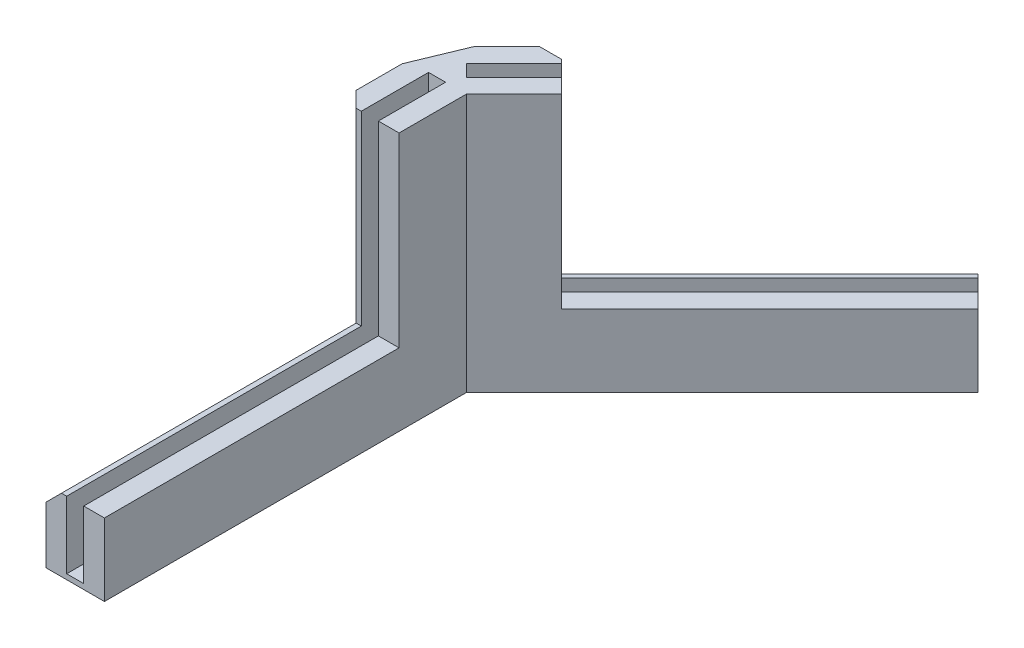
ISO-10303-21;
HEADER;
FILE_DESCRIPTION(('STEP AP214'),'2;1');
FILE_NAME('part.step','',(''),(''),'','','');
FILE_SCHEMA(('AUTOMOTIVE_DESIGN { 1 0 10303 214 1 1 1 1 }'));
ENDSEC;
DATA;
#1=APPLICATION_CONTEXT('core data for automotive mechanical design processes');
#2=APPLICATION_PROTOCOL_DEFINITION('international standard','automotive_design',2000,#1);
#3=PRODUCT_CONTEXT('',#1,'mechanical');
#4=PRODUCT('Part','Part','',(#3));
#5=PRODUCT_RELATED_PRODUCT_CATEGORY('part','',(#4));
#6=PRODUCT_DEFINITION_FORMATION('','',#4);
#7=PRODUCT_DEFINITION_CONTEXT('part definition',#1,'design');
#8=PRODUCT_DEFINITION('design','',#6,#7);
#9=PRODUCT_DEFINITION_SHAPE('','',#8);
#10=(LENGTH_UNIT() NAMED_UNIT(*) SI_UNIT(.MILLI.,.METRE.));
#11=(NAMED_UNIT(*) PLANE_ANGLE_UNIT() SI_UNIT($,.RADIAN.));
#12=(NAMED_UNIT(*) SI_UNIT($,.STERADIAN.) SOLID_ANGLE_UNIT());
#13=UNCERTAINTY_MEASURE_WITH_UNIT(LENGTH_MEASURE(1.E-05),#10,'distance_accuracy_value','');
#14=(GEOMETRIC_REPRESENTATION_CONTEXT(3) GLOBAL_UNCERTAINTY_ASSIGNED_CONTEXT((#13)) GLOBAL_UNIT_ASSIGNED_CONTEXT((#10,
#11,#12)) REPRESENTATION_CONTEXT('',''));
#15=CARTESIAN_POINT('',(0.,0.,0.));
#16=DIRECTION('',(0.,0.,1.));
#17=DIRECTION('',(1.,0.,0.));
#18=AXIS2_PLACEMENT_3D('',#15,#16,#17);
#19=CARTESIAN_POINT('',(-13.,50.,3.11837383565331));
#20=DIRECTION('',(0.923879869163213,0.,0.382682619614433));
#21=DIRECTION('',(0.,-1.,0.));
#22=AXIS2_PLACEMENT_3D('',#19,#20,#21);
#23=PLANE('',#22);
#24=DIRECTION('',(0.,-1.,0.));
#25=VECTOR('',#24,1.);
#26=CARTESIAN_POINT('',(-13.,50.,3.11837383565331));
#27=LINE('',#26,#25);
#28=CARTESIAN_POINT('',(-13.,50.,3.11837383565332));
#29=VERTEX_POINT('',#28);
#30=CARTESIAN_POINT('',(-13.,0.,3.11837383565332));
#31=VERTEX_POINT('',#30);
#32=EDGE_CURVE('E384',#29,#31,#27,.T.);
#33=ORIENTED_EDGE('',*,*,#32,.F.);
#34=DIRECTION('',(0.382682619614433,0.,-0.923879869163213));
#35=VECTOR('',#34,1.);
#36=CARTESIAN_POINT('',(-13.,50.,3.11837383565331));
#37=LINE('',#36,#35);
#38=CARTESIAN_POINT('',(-8.89951235406099,50.,-6.78110368347837));
#39=VERTEX_POINT('',#38);
#40=EDGE_CURVE('E389',#39,#29,#37,.F.);
#41=ORIENTED_EDGE('',*,*,#40,.F.);
#42=DIRECTION('',(0.,1.,0.));
#43=VECTOR('',#42,1.);
#44=CARTESIAN_POINT('',(-8.89951235406099,50.,-6.78110368347838));
#45=LINE('',#44,#43);
#46=CARTESIAN_POINT('',(-8.89951235406099,0.,-6.78110368347837));
#47=VERTEX_POINT('',#46);
#48=EDGE_CURVE('E387',#47,#39,#45,.T.);
#49=ORIENTED_EDGE('',*,*,#48,.F.);
#50=DIRECTION('',(-0.382682619614433,0.,0.923879869163213));
#51=VECTOR('',#50,1.);
#52=CARTESIAN_POINT('',(-9.99369246144622,0.,-4.13951265572129));
#53=LINE('',#52,#51);
#54=EDGE_CURVE('E227',#31,#47,#53,.F.);
#55=ORIENTED_EDGE('',*,*,#54,.F.);
#56=EDGE_LOOP('',(#33,#41,#49,#55));
#57=FACE_BOUND('',#56,.T.);
#58=ADVANCED_FACE('F40',(#57),#23,.F.);
#59=CARTESIAN_POINT('',(-1.7,50.,15.));
#60=DIRECTION('',(0.,0.,-1.));
#61=DIRECTION('',(-1.,0.,0.));
#62=AXIS2_PLACEMENT_3D('',#59,#60,#61);
#63=PLANE('',#62);
#64=DIRECTION('',(1.,0.,0.));
#65=VECTOR('',#64,1.);
#66=CARTESIAN_POINT('',(-9.,50.,15.));
#67=LINE('',#66,#65);
#68=CARTESIAN_POINT('',(-10.0000000000001,50.,15.));
#69=VERTEX_POINT('',#68);
#70=CARTESIAN_POINT('',(-9.,50.,15.));
#71=VERTEX_POINT('',#70);
#72=EDGE_CURVE('E354',#69,#71,#67,.T.);
#73=ORIENTED_EDGE('',*,*,#72,.F.);
#74=DIRECTION('',(0.,-1.,0.));
#75=VECTOR('',#74,1.);
#76=CARTESIAN_POINT('',(-10.0000000000001,50.,15.));
#77=LINE('',#76,#75);
#78=CARTESIAN_POINT('',(-10.0000000000001,14.,15.));
#79=VERTEX_POINT('',#78);
#80=EDGE_CURVE('E392',#69,#79,#77,.T.);
#81=ORIENTED_EDGE('',*,*,#80,.T.);
#82=DIRECTION('',(-1.,0.,0.));
#83=VECTOR('',#82,1.);
#84=CARTESIAN_POINT('',(-13.0000000000001,14.,15.));
#85=LINE('',#84,#83);
#86=CARTESIAN_POINT('',(-9.,14.,15.));
#87=VERTEX_POINT('',#86);
#88=EDGE_CURVE('E311',#87,#79,#85,.T.);
#89=ORIENTED_EDGE('',*,*,#88,.F.);
#90=DIRECTION('',(0.,-1.,0.));
#91=VECTOR('',#90,1.);
#92=CARTESIAN_POINT('',(-9.,50.,15.));
#93=LINE('',#92,#91);
#94=EDGE_CURVE('E381',#71,#87,#93,.T.);
#95=ORIENTED_EDGE('',*,*,#94,.F.);
#96=EDGE_LOOP('',(#73,#81,#89,#95));
#97=FACE_BOUND('',#96,.T.);
#98=ADVANCED_FACE('F509',(#97),#63,.F.);
#99=DIRECTION('',(-1.,0.,0.));
#100=VECTOR('',#99,1.);
#101=CARTESIAN_POINT('',(-5.70000000000014,14.,15.));
#102=LINE('',#101,#100);
#103=CARTESIAN_POINT('',(-1.7,14.,15.));
#104=VERTEX_POINT('',#103);
#105=CARTESIAN_POINT('',(-5.70000000000014,14.,15.));
#106=VERTEX_POINT('',#105);
#107=EDGE_CURVE('E307',#104,#106,#102,.T.);
#108=ORIENTED_EDGE('',*,*,#107,.F.);
#109=DIRECTION('',(0.,-1.,0.));
#110=VECTOR('',#109,1.);
#111=CARTESIAN_POINT('',(-1.7,50.,15.));
#112=LINE('',#111,#110);
#113=CARTESIAN_POINT('',(-1.7,50.,15.));
#114=VERTEX_POINT('',#113);
#115=EDGE_CURVE('E367',#114,#104,#112,.T.);
#116=ORIENTED_EDGE('',*,*,#115,.F.);
#117=DIRECTION('',(1.,0.,0.));
#118=VECTOR('',#117,1.);
#119=CARTESIAN_POINT('',(-1.7,50.,15.));
#120=LINE('',#119,#118);
#121=CARTESIAN_POINT('',(-5.7,50.,15.));
#122=VERTEX_POINT('',#121);
#123=EDGE_CURVE('E363',#122,#114,#120,.T.);
#124=ORIENTED_EDGE('',*,*,#123,.F.);
#125=DIRECTION('',(0.,-1.,0.));
#126=VECTOR('',#125,1.);
#127=CARTESIAN_POINT('',(-5.7,50.,15.));
#128=LINE('',#127,#126);
#129=EDGE_CURVE('E373',#122,#106,#128,.T.);
#130=ORIENTED_EDGE('',*,*,#129,.T.);
#131=EDGE_LOOP('',(#108,#116,#124,#130));
#132=FACE_BOUND('',#131,.T.);
#133=ADVANCED_FACE('F511',(#132),#63,.F.);
#134=CARTESIAN_POINT('',(-9.00000000000004,50.,1.99999999999999));
#135=DIRECTION('',(-1.,0.,0.));
#136=DIRECTION('',(0.,0.,1.));
#137=AXIS2_PLACEMENT_3D('',#134,#135,#136);
#138=PLANE('',#137);
#139=DIRECTION('',(0.,0.,-1.));
#140=VECTOR('',#139,1.);
#141=CARTESIAN_POINT('',(-9.00000000000004,1.,15.));
#142=LINE('',#141,#140);
#143=CARTESIAN_POINT('',(-9.,1.,72.));
#144=VERTEX_POINT('',#143);
#145=CARTESIAN_POINT('',(-9.00000000000004,1.,1.99999999999999));
#146=VERTEX_POINT('',#145);
#147=EDGE_CURVE('E345',#144,#146,#142,.T.);
#148=ORIENTED_EDGE('',*,*,#147,.T.);
#149=DIRECTION('',(0.,-1.,0.));
#150=VECTOR('',#149,1.);
#151=CARTESIAN_POINT('',(-9.00000000000004,50.,1.99999999999999));
#152=LINE('',#151,#150);
#153=CARTESIAN_POINT('',(-9.00000000000004,50.,1.99999999999999));
#154=VERTEX_POINT('',#153);
#155=EDGE_CURVE('E378',#154,#146,#152,.T.);
#156=ORIENTED_EDGE('',*,*,#155,.F.);
#157=DIRECTION('',(0.,0.,-1.));
#158=VECTOR('',#157,1.);
#159=CARTESIAN_POINT('',(-9.00000000000004,50.,1.99999999999999));
#160=LINE('',#159,#158);
#161=EDGE_CURVE('E357',#71,#154,#160,.T.);
#162=ORIENTED_EDGE('',*,*,#161,.F.);
#163=ORIENTED_EDGE('',*,*,#94,.T.);
#164=DIRECTION('',(0.,0.,-1.));
#165=VECTOR('',#164,1.);
#166=CARTESIAN_POINT('',(-9.00000000000013,14.,72.));
#167=LINE('',#166,#165);
#168=CARTESIAN_POINT('',(-9.00000000000013,14.,72.));
#169=VERTEX_POINT('',#168);
#170=EDGE_CURVE('E329',#169,#87,#167,.T.);
#171=ORIENTED_EDGE('',*,*,#170,.F.);
#172=DIRECTION('',(0.,1.,0.));
#173=VECTOR('',#172,1.);
#174=CARTESIAN_POINT('',(-9.,1.,72.));
#175=LINE('',#174,#173);
#176=EDGE_CURVE('E324',#144,#169,#175,.T.);
#177=ORIENTED_EDGE('',*,*,#176,.F.);
#178=EDGE_LOOP('',(#148,#156,#162,#163,#171,#177));
#179=FACE_BOUND('',#178,.T.);
#180=ADVANCED_FACE('F485',(#179),#138,.F.);
#181=CARTESIAN_POINT('',(-5.7,50.,1.99999999999999));
#182=DIRECTION('',(0.,0.,-1.));
#183=DIRECTION('',(-1.,0.,0.));
#184=AXIS2_PLACEMENT_3D('',#181,#182,#183);
#185=PLANE('',#184);
#186=DIRECTION('',(-1.,0.,0.));
#187=VECTOR('',#186,1.);
#188=CARTESIAN_POINT('',(-5.7,1.,1.99999999999998));
#189=LINE('',#188,#187);
#190=CARTESIAN_POINT('',(-5.7,1.,1.99999999999999));
#191=VERTEX_POINT('',#190);
#192=EDGE_CURVE('E342',#191,#146,#189,.T.);
#193=ORIENTED_EDGE('',*,*,#192,.F.);
#194=DIRECTION('',(0.,-1.,0.));
#195=VECTOR('',#194,1.);
#196=CARTESIAN_POINT('',(-5.7,50.,1.99999999999999));
#197=LINE('',#196,#195);
#198=CARTESIAN_POINT('',(-5.7,50.,1.99999999999999));
#199=VERTEX_POINT('',#198);
#200=EDGE_CURVE('E375',#199,#191,#197,.T.);
#201=ORIENTED_EDGE('',*,*,#200,.F.);
#202=DIRECTION('',(1.,0.,0.));
#203=VECTOR('',#202,1.);
#204=CARTESIAN_POINT('',(-5.7,50.,1.99999999999999));
#205=LINE('',#204,#203);
#206=EDGE_CURVE('E359',#154,#199,#205,.T.);
#207=ORIENTED_EDGE('',*,*,#206,.F.);
#208=ORIENTED_EDGE('',*,*,#155,.T.);
#209=EDGE_LOOP('',(#193,#201,#207,#208));
#210=FACE_BOUND('',#209,.T.);
#211=ADVANCED_FACE('F490',(#210),#185,.F.);
#212=CARTESIAN_POINT('',(-5.7,50.,15.));
#213=DIRECTION('',(1.,0.,0.));
#214=DIRECTION('',(0.,0.,-1.));
#215=AXIS2_PLACEMENT_3D('',#212,#213,#214);
#216=PLANE('',#215);
#217=DIRECTION('',(0.,0.,-1.));
#218=VECTOR('',#217,1.);
#219=CARTESIAN_POINT('',(-5.7,1.,15.));
#220=LINE('',#219,#218);
#221=CARTESIAN_POINT('',(-5.7,1.,72.));
#222=VERTEX_POINT('',#221);
#223=EDGE_CURVE('E347',#222,#191,#220,.T.);
#224=ORIENTED_EDGE('',*,*,#223,.F.);
#225=DIRECTION('',(0.,-1.,0.));
#226=VECTOR('',#225,1.);
#227=CARTESIAN_POINT('',(-5.7,1.,72.));
#228=LINE('',#227,#226);
#229=CARTESIAN_POINT('',(-5.70000000000014,14.,72.));
#230=VERTEX_POINT('',#229);
#231=EDGE_CURVE('E318',#230,#222,#228,.T.);
#232=ORIENTED_EDGE('',*,*,#231,.F.);
#233=DIRECTION('',(0.,0.,-1.));
#234=VECTOR('',#233,1.);
#235=CARTESIAN_POINT('',(-5.70000000000014,14.,72.));
#236=LINE('',#235,#234);
#237=EDGE_CURVE('E336',#230,#106,#236,.T.);
#238=ORIENTED_EDGE('',*,*,#237,.T.);
#239=ORIENTED_EDGE('',*,*,#129,.F.);
#240=DIRECTION('',(0.,0.,1.));
#241=VECTOR('',#240,1.);
#242=CARTESIAN_POINT('',(-5.7,50.,15.));
#243=LINE('',#242,#241);
#244=EDGE_CURVE('E361',#199,#122,#243,.T.);
#245=ORIENTED_EDGE('',*,*,#244,.F.);
#246=ORIENTED_EDGE('',*,*,#200,.T.);
#247=EDGE_LOOP('',(#224,#232,#238,#239,#245,#246));
#248=FACE_BOUND('',#247,.T.);
#249=ADVANCED_FACE('F523',(#248),#216,.F.);
#250=CARTESIAN_POINT('',(-13.,50.,15.));
#251=DIRECTION('',(1.,0.,0.));
#252=DIRECTION('',(0.,0.,-1.));
#253=AXIS2_PLACEMENT_3D('',#250,#251,#252);
#254=PLANE('',#253);
#255=DIRECTION('',(0.,0.,-1.));
#256=VECTOR('',#255,1.);
#257=CARTESIAN_POINT('',(-13.,11.0000000000001,15.));
#258=LINE('',#257,#256);
#259=CARTESIAN_POINT('',(-13.0000000000001,11.0000000000001,72.));
#260=VERTEX_POINT('',#259);
#261=CARTESIAN_POINT('',(-13.,11.0000000000001,12.0000000000001));
#262=VERTEX_POINT('',#261);
#263=EDGE_CURVE('E395',#260,#262,#258,.T.);
#264=ORIENTED_EDGE('',*,*,#263,.T.);
#265=DIRECTION('',(0.,1.,0.));
#266=VECTOR('',#265,1.);
#267=CARTESIAN_POINT('',(-13.,50.,12.0000000000001));
#268=LINE('',#267,#266);
#269=CARTESIAN_POINT('',(-13.,50.,12.0000000000001));
#270=VERTEX_POINT('',#269);
#271=EDGE_CURVE('E397',#262,#270,#268,.T.);
#272=ORIENTED_EDGE('',*,*,#271,.T.);
#273=DIRECTION('',(0.,0.,1.));
#274=VECTOR('',#273,1.);
#275=CARTESIAN_POINT('',(-13.,50.,15.));
#276=LINE('',#275,#274);
#277=EDGE_CURVE('E351',#29,#270,#276,.T.);
#278=ORIENTED_EDGE('',*,*,#277,.F.);
#279=ORIENTED_EDGE('',*,*,#32,.T.);
#280=DIRECTION('',(0.,0.,1.));
#281=VECTOR('',#280,1.);
#282=CARTESIAN_POINT('',(-13.,0.,15.));
#283=LINE('',#282,#281);
#284=CARTESIAN_POINT('',(-13.,0.,72.));
#285=VERTEX_POINT('',#284);
#286=EDGE_CURVE('E350',#31,#285,#283,.T.);
#287=ORIENTED_EDGE('',*,*,#286,.T.);
#288=DIRECTION('',(0.,-1.,0.));
#289=VECTOR('',#288,1.);
#290=CARTESIAN_POINT('',(-13.,0.,72.));
#291=LINE('',#290,#289);
#292=EDGE_CURVE('E308',#260,#285,#291,.T.);
#293=ORIENTED_EDGE('',*,*,#292,.F.);
#294=EDGE_LOOP('',(#264,#272,#278,#279,#287,#293));
#295=FACE_BOUND('',#294,.T.);
#296=ADVANCED_FACE('F505',(#295),#254,.F.);
#297=CARTESIAN_POINT('',(-1.7,50.,1.99999999999999));
#298=DIRECTION('',(-1.,0.,0.));
#299=DIRECTION('',(0.,0.,1.));
#300=AXIS2_PLACEMENT_3D('',#297,#298,#299);
#301=PLANE('',#300);
#302=DIRECTION('',(0.,0.,-1.));
#303=VECTOR('',#302,1.);
#304=CARTESIAN_POINT('',(-1.7,0.,1.99999999999999));
#305=LINE('',#304,#303);
#306=CARTESIAN_POINT('',(-1.7,0.,72.));
#307=VERTEX_POINT('',#306);
#308=CARTESIAN_POINT('',(-1.7,0.,1.99999999999999));
#309=VERTEX_POINT('',#308);
#310=EDGE_CURVE('E355',#307,#309,#305,.T.);
#311=ORIENTED_EDGE('',*,*,#310,.T.);
#312=DIRECTION('',(0.,-1.,0.));
#313=VECTOR('',#312,1.);
#314=CARTESIAN_POINT('',(-1.7,50.,1.99999999999999));
#315=LINE('',#314,#313);
#316=CARTESIAN_POINT('',(-1.7,50.,1.99999999999999));
#317=VERTEX_POINT('',#316);
#318=EDGE_CURVE('E287',#317,#309,#315,.T.);
#319=ORIENTED_EDGE('',*,*,#318,.F.);
#320=DIRECTION('',(0.,0.,-1.));
#321=VECTOR('',#320,1.);
#322=CARTESIAN_POINT('',(-1.7,50.,1.99999999999999));
#323=LINE('',#322,#321);
#324=EDGE_CURVE('E365',#114,#317,#323,.T.);
#325=ORIENTED_EDGE('',*,*,#324,.F.);
#326=ORIENTED_EDGE('',*,*,#115,.T.);
#327=DIRECTION('',(0.,0.,-1.));
#328=VECTOR('',#327,1.);
#329=CARTESIAN_POINT('',(-1.70000000000015,14.,72.));
#330=LINE('',#329,#328);
#331=CARTESIAN_POINT('',(-1.70000000000015,14.,72.));
#332=VERTEX_POINT('',#331);
#333=EDGE_CURVE('E339',#332,#104,#330,.T.);
#334=ORIENTED_EDGE('',*,*,#333,.F.);
#335=DIRECTION('',(0.,1.,0.));
#336=VECTOR('',#335,1.);
#337=CARTESIAN_POINT('',(-1.7,0.,72.));
#338=LINE('',#337,#336);
#339=EDGE_CURVE('E314',#307,#332,#338,.T.);
#340=ORIENTED_EDGE('',*,*,#339,.F.);
#341=EDGE_LOOP('',(#311,#319,#325,#326,#334,#340));
#342=FACE_BOUND('',#341,.T.);
#343=ADVANCED_FACE('F470',(#342),#301,.F.);
#344=CARTESIAN_POINT('',(0.,50.,0.));
#345=DIRECTION('',(0.,-1.,0.));
#346=DIRECTION('',(0.,0.,-1.));
#347=AXIS2_PLACEMENT_3D('',#344,#345,#346);
#348=PLANE('',#347);
#349=ORIENTED_EDGE('',*,*,#277,.T.);
#350=DIRECTION('',(-0.707106781186549,0.,-0.707106781186546));
#351=VECTOR('',#350,1.);
#352=CARTESIAN_POINT('',(-10.0000000000001,50.,15.));
#353=LINE('',#352,#351);
#354=EDGE_CURVE('E401',#270,#69,#353,.F.);
#355=ORIENTED_EDGE('',*,*,#354,.T.);
#356=ORIENTED_EDGE('',*,*,#72,.T.);
#357=ORIENTED_EDGE('',*,*,#161,.T.);
#358=ORIENTED_EDGE('',*,*,#206,.T.);
#359=ORIENTED_EDGE('',*,*,#244,.T.);
#360=ORIENTED_EDGE('',*,*,#123,.T.);
#361=ORIENTED_EDGE('',*,*,#324,.T.);
#362=DIRECTION('',(-0.707105537080835,0.,0.707108025290071));
#363=VECTOR('',#362,1.);
#364=CARTESIAN_POINT('',(-1.7,50.,1.99999999999999));
#365=LINE('',#364,#363);
#366=CARTESIAN_POINT('',(7.49237198205085,50.,-7.19240432877094));
#367=VERTEX_POINT('',#366);
#368=EDGE_CURVE('E285',#367,#317,#365,.T.);
#369=ORIENTED_EDGE('',*,*,#368,.F.);
#370=DIRECTION('',(0.707108025290071,0.,0.707105537080835));
#371=VECTOR('',#370,1.);
#372=CARTESIAN_POINT('',(7.49237198205085,50.,-7.19240432877094));
#373=LINE('',#372,#371);
#374=CARTESIAN_POINT('',(4.66393988089057,50.,-10.0208264770943));
#375=VERTEX_POINT('',#374);
#376=EDGE_CURVE('E282',#375,#367,#373,.T.);
#377=ORIENTED_EDGE('',*,*,#376,.F.);
#378=DIRECTION('',(0.707105537080835,0.,-0.707108025290071));
#379=VECTOR('',#378,1.);
#380=CARTESIAN_POINT('',(4.66393988089057,50.,-10.0208264770943));
#381=LINE('',#380,#379);
#382=CARTESIAN_POINT('',(-4.52843210116029,50.,-0.828422148323351));
#383=VERTEX_POINT('',#382);
#384=EDGE_CURVE('E280',#383,#375,#381,.T.);
#385=ORIENTED_EDGE('',*,*,#384,.F.);
#386=DIRECTION('',(0.707108025290071,0.,0.707105537080835));
#387=VECTOR('',#386,1.);
#388=CARTESIAN_POINT('',(-4.52843210116029,50.,-0.828422148323351));
#389=LINE('',#388,#387);
#390=CARTESIAN_POINT('',(-6.86188858461755,50.,-3.16187042069014));
#391=VERTEX_POINT('',#390);
#392=EDGE_CURVE('E277',#391,#383,#389,.T.);
#393=ORIENTED_EDGE('',*,*,#392,.F.);
#394=DIRECTION('',(-0.707105537080837,0.,0.707108025290069));
#395=VECTOR('',#394,1.);
#396=CARTESIAN_POINT('',(-6.86188858461755,50.,-3.16187042069014));
#397=LINE('',#396,#395);
#398=CARTESIAN_POINT('',(2.33048339743333,50.,-12.354274749461));
#399=VERTEX_POINT('',#398);
#400=EDGE_CURVE('E274',#399,#391,#397,.T.);
#401=ORIENTED_EDGE('',*,*,#400,.F.);
#402=DIRECTION('',(0.707108025290071,0.,0.707105537080835));
#403=VECTOR('',#402,1.);
#404=CARTESIAN_POINT('',(2.33048339743333,50.,-12.354274749461));
#405=LINE('',#404,#403);
#406=CARTESIAN_POINT('',(1.62337537214328,50.,-13.0613802865418));
#407=VERTEX_POINT('',#406);
#408=EDGE_CURVE('E272',#407,#399,#405,.T.);
#409=ORIENTED_EDGE('',*,*,#408,.F.);
#410=DIRECTION('',(0.999999999998452,0.,-1.75942962165279E-06));
#411=VECTOR('',#410,1.);
#412=CARTESIAN_POINT('',(-2.61926531496947,50.,-13.0613728219141));
#413=LINE('',#412,#411);
#414=CARTESIAN_POINT('',(-2.61926531496946,50.,-13.0613728219141));
#415=VERTEX_POINT('',#414);
#416=EDGE_CURVE('E399',#407,#415,#413,.F.);
#417=ORIENTED_EDGE('',*,*,#416,.T.);
#418=DIRECTION('',(0.707105537080835,0.,-0.707108025290071));
#419=VECTOR('',#418,1.);
#420=CARTESIAN_POINT('',(-0.497948703726949,50.,-15.1826968977844));
#421=LINE('',#420,#419);
#422=EDGE_CURVE('E270',#39,#415,#421,.T.);
#423=ORIENTED_EDGE('',*,*,#422,.F.);
#424=ORIENTED_EDGE('',*,*,#40,.T.);
#425=EDGE_LOOP('',(#349,#355,#356,#357,#358,#359,#360,#361,#369,#377,#385,#393,#401,#409,#417,
#423,#424));
#426=FACE_BOUND('',#425,.T.);
#427=ADVANCED_FACE('F452',(#426),#348,.F.);
#428=CARTESIAN_POINT('',(0.,0.,0.));
#429=DIRECTION('',(0.,-1.,0.));
#430=DIRECTION('',(0.,0.,-1.));
#431=AXIS2_PLACEMENT_3D('',#428,#429,#430);
#432=PLANE('',#431);
#433=ORIENTED_EDGE('',*,*,#286,.F.);
#434=ORIENTED_EDGE('',*,*,#54,.T.);
#435=DIRECTION('',(0.707105537080835,0.,-0.707108025290071));
#436=VECTOR('',#435,1.);
#437=CARTESIAN_POINT('',(-0.497948703726949,0.,-15.1826968977844));
#438=LINE('',#437,#436);
#439=CARTESIAN_POINT('',(39.8070669098806,0.,-55.4878543393184));
#440=VERTEX_POINT('',#439);
#441=EDGE_CURVE('E215',#47,#440,#438,.T.);
#442=ORIENTED_EDGE('',*,*,#441,.T.);
#443=DIRECTION('',(0.707108025290071,0.,0.707105537080835));
#444=VECTOR('',#443,1.);
#445=CARTESIAN_POINT('',(39.8070669098806,0.,-55.4878543393184));
#446=LINE('',#445,#444);
#447=CARTESIAN_POINT('',(47.7973875956584,0.,-47.497561770305));
#448=VERTEX_POINT('',#447);
#449=EDGE_CURVE('E219',#440,#448,#446,.T.);
#450=ORIENTED_EDGE('',*,*,#449,.T.);
#451=DIRECTION('',(-0.707105537080835,0.,0.707108025290071));
#452=VECTOR('',#451,1.);
#453=CARTESIAN_POINT('',(-1.7,0.,1.99999999999999));
#454=LINE('',#453,#452);
#455=EDGE_CURVE('E229',#448,#309,#454,.T.);
#456=ORIENTED_EDGE('',*,*,#455,.T.);
#457=ORIENTED_EDGE('',*,*,#310,.F.);
#458=DIRECTION('',(1.,0.,0.));
#459=VECTOR('',#458,1.);
#460=CARTESIAN_POINT('',(-13.,0.,72.));
#461=LINE('',#460,#459);
#462=EDGE_CURVE('E310',#285,#307,#461,.T.);
#463=ORIENTED_EDGE('',*,*,#462,.F.);
#464=EDGE_LOOP('',(#433,#434,#442,#450,#456,#457,#463));
#465=FACE_BOUND('',#464,.T.);
#466=ADVANCED_FACE('F224',(#465),#432,.T.);
#467=CARTESIAN_POINT('',(-5.7,1.,15.));
#468=DIRECTION('',(0.,-1.,0.));
#469=DIRECTION('',(0.,0.,-1.));
#470=AXIS2_PLACEMENT_3D('',#467,#468,#469);
#471=PLANE('',#470);
#472=ORIENTED_EDGE('',*,*,#192,.T.);
#473=ORIENTED_EDGE('',*,*,#147,.F.);
#474=DIRECTION('',(-1.,0.,0.));
#475=VECTOR('',#474,1.);
#476=CARTESIAN_POINT('',(-9.,1.,72.));
#477=LINE('',#476,#475);
#478=EDGE_CURVE('E321',#222,#144,#477,.T.);
#479=ORIENTED_EDGE('',*,*,#478,.F.);
#480=ORIENTED_EDGE('',*,*,#223,.T.);
#481=EDGE_LOOP('',(#472,#473,#479,#480));
#482=FACE_BOUND('',#481,.T.);
#483=ADVANCED_FACE('F482',(#482),#471,.F.);
#484=CARTESIAN_POINT('',(-5.70000000000014,14.,72.));
#485=DIRECTION('',(0.,-1.,0.));
#486=DIRECTION('',(0.,0.,-1.));
#487=AXIS2_PLACEMENT_3D('',#484,#485,#486);
#488=PLANE('',#487);
#489=ORIENTED_EDGE('',*,*,#107,.T.);
#490=ORIENTED_EDGE('',*,*,#237,.F.);
#491=DIRECTION('',(-1.,0.,0.));
#492=VECTOR('',#491,1.);
#493=CARTESIAN_POINT('',(-5.70000000000014,14.,72.));
#494=LINE('',#493,#492);
#495=EDGE_CURVE('E316',#332,#230,#494,.T.);
#496=ORIENTED_EDGE('',*,*,#495,.F.);
#497=ORIENTED_EDGE('',*,*,#333,.T.);
#498=EDGE_LOOP('',(#489,#490,#496,#497));
#499=FACE_BOUND('',#498,.T.);
#500=ADVANCED_FACE('F476',(#499),#488,.F.);
#501=CARTESIAN_POINT('',(-13.0000000000001,14.,72.));
#502=DIRECTION('',(0.,-1.,0.));
#503=DIRECTION('',(0.,0.,-1.));
#504=AXIS2_PLACEMENT_3D('',#501,#502,#503);
#505=PLANE('',#504);
#506=ORIENTED_EDGE('',*,*,#88,.T.);
#507=DIRECTION('',(0.,0.,1.));
#508=VECTOR('',#507,1.);
#509=CARTESIAN_POINT('',(-10.0000000000001,14.,72.));
#510=LINE('',#509,#508);
#511=CARTESIAN_POINT('',(-10.0000000000001,14.,72.));
#512=VERTEX_POINT('',#511);
#513=EDGE_CURVE('E403',#79,#512,#510,.T.);
#514=ORIENTED_EDGE('',*,*,#513,.T.);
#515=DIRECTION('',(-1.,0.,0.));
#516=VECTOR('',#515,1.);
#517=CARTESIAN_POINT('',(-13.0000000000001,14.,72.));
#518=LINE('',#517,#516);
#519=EDGE_CURVE('E326',#169,#512,#518,.T.);
#520=ORIENTED_EDGE('',*,*,#519,.F.);
#521=ORIENTED_EDGE('',*,*,#170,.T.);
#522=EDGE_LOOP('',(#506,#514,#520,#521));
#523=FACE_BOUND('',#522,.T.);
#524=ADVANCED_FACE('F499',(#523),#505,.F.);
#525=CARTESIAN_POINT('',(0.,0.,72.));
#526=DIRECTION('',(0.,0.,-1.));
#527=DIRECTION('',(-1.,0.,0.));
#528=AXIS2_PLACEMENT_3D('',#525,#526,#527);
#529=PLANE('',#528);
#530=ORIENTED_EDGE('',*,*,#519,.T.);
#531=DIRECTION('',(0.707106781186549,0.707106781186546,0.));
#532=VECTOR('',#531,1.);
#533=CARTESIAN_POINT('',(-13.,11.0000000000001,72.));
#534=LINE('',#533,#532);
#535=EDGE_CURVE('E405',#512,#260,#534,.F.);
#536=ORIENTED_EDGE('',*,*,#535,.T.);
#537=ORIENTED_EDGE('',*,*,#292,.T.);
#538=ORIENTED_EDGE('',*,*,#462,.T.);
#539=ORIENTED_EDGE('',*,*,#339,.T.);
#540=ORIENTED_EDGE('',*,*,#495,.T.);
#541=ORIENTED_EDGE('',*,*,#231,.T.);
#542=ORIENTED_EDGE('',*,*,#478,.T.);
#543=ORIENTED_EDGE('',*,*,#176,.T.);
#544=EDGE_LOOP('',(#530,#536,#537,#538,#539,#540,#541,#542,#543));
#545=FACE_BOUND('',#544,.T.);
#546=ADVANCED_FACE('F467',(#545),#529,.F.);
#547=CARTESIAN_POINT('',(7.49237198205085,50.,-7.19240432877094));
#548=DIRECTION('',(-0.707105537080835,0.,0.707108025290071));
#549=DIRECTION('',(-0.707108025290071,0.,-0.707105537080835));
#550=AXIS2_PLACEMENT_3D('',#547,#548,#549);
#551=PLANE('',#550);
#552=DIRECTION('',(-0.707108025290071,0.,-0.707105537080835));
#553=VECTOR('',#552,1.);
#554=CARTESIAN_POINT('',(-0.497948703727053,14.,-15.1826968977845));
#555=LINE('',#554,#553);
#556=CARTESIAN_POINT('',(2.33048339743333,14.,-12.354274749461));
#557=VERTEX_POINT('',#556);
#558=CARTESIAN_POINT('',(1.62337537214328,14.,-13.0613802865418));
#559=VERTEX_POINT('',#558);
#560=EDGE_CURVE('E220',#557,#559,#555,.T.);
#561=ORIENTED_EDGE('',*,*,#560,.T.);
#562=DIRECTION('',(0.,1.,0.));
#563=VECTOR('',#562,1.);
#564=CARTESIAN_POINT('',(1.62337537214328,50.,-13.0613802865418));
#565=LINE('',#564,#563);
#566=EDGE_CURVE('E13',#559,#407,#565,.T.);
#567=ORIENTED_EDGE('',*,*,#566,.T.);
#568=ORIENTED_EDGE('',*,*,#408,.T.);
#569=DIRECTION('',(0.,-1.,0.));
#570=VECTOR('',#569,1.);
#571=CARTESIAN_POINT('',(2.33048339743333,50.,-12.354274749461));
#572=LINE('',#571,#570);
#573=EDGE_CURVE('E304',#399,#557,#572,.T.);
#574=ORIENTED_EDGE('',*,*,#573,.T.);
#575=EDGE_LOOP('',(#561,#567,#568,#574));
#576=FACE_BOUND('',#575,.T.);
#577=ADVANCED_FACE('F430',(#576),#551,.F.);
#578=DIRECTION('',(-0.707108025290071,0.,-0.707105537080835));
#579=VECTOR('',#578,1.);
#580=CARTESIAN_POINT('',(4.66393988089047,14.,-10.0208264770944));
#581=LINE('',#580,#579);
#582=CARTESIAN_POINT('',(7.49237198205085,14.,-7.19240432877094));
#583=VERTEX_POINT('',#582);
#584=CARTESIAN_POINT('',(4.66393988089047,14.,-10.0208264770944));
#585=VERTEX_POINT('',#584);
#586=EDGE_CURVE('E253',#583,#585,#581,.T.);
#587=ORIENTED_EDGE('',*,*,#586,.T.);
#588=DIRECTION('',(0.,-1.,0.));
#589=VECTOR('',#588,1.);
#590=CARTESIAN_POINT('',(4.66393988089057,50.,-10.0208264770943));
#591=LINE('',#590,#589);
#592=EDGE_CURVE('E295',#375,#585,#591,.T.);
#593=ORIENTED_EDGE('',*,*,#592,.F.);
#594=ORIENTED_EDGE('',*,*,#376,.T.);
#595=DIRECTION('',(0.,-1.,0.));
#596=VECTOR('',#595,1.);
#597=CARTESIAN_POINT('',(7.49237198205085,50.,-7.19240432877094));
#598=LINE('',#597,#596);
#599=EDGE_CURVE('E292',#367,#583,#598,.T.);
#600=ORIENTED_EDGE('',*,*,#599,.T.);
#601=EDGE_LOOP('',(#587,#593,#594,#600));
#602=FACE_BOUND('',#601,.T.);
#603=ADVANCED_FACE('F455',(#602),#551,.F.);
#604=CARTESIAN_POINT('',(-6.86188858461755,50.,-3.16187042069014));
#605=DIRECTION('',(-0.707108025290068,0.,-0.707105537080838));
#606=DIRECTION('',(0.707105537080837,0.,-0.707108025290069));
#607=AXIS2_PLACEMENT_3D('',#604,#605,#606);
#608=PLANE('',#607);
#609=DIRECTION('',(-0.707105537080835,0.,0.707108025290071));
#610=VECTOR('',#609,1.);
#611=CARTESIAN_POINT('',(2.3304833974333,1.,-12.3542747494611));
#612=LINE('',#611,#610);
#613=CARTESIAN_POINT('',(42.6354990110409,1.,-52.6594321909951));
#614=VERTEX_POINT('',#613);
#615=CARTESIAN_POINT('',(-6.86188858461755,1.,-3.16187042069014));
#616=VERTEX_POINT('',#615);
#617=EDGE_CURVE('E266',#614,#616,#612,.T.);
#618=ORIENTED_EDGE('',*,*,#617,.F.);
#619=DIRECTION('',(0.,1.,0.));
#620=VECTOR('',#619,1.);
#621=CARTESIAN_POINT('',(42.6354990110409,1.,-52.6594321909951));
#622=LINE('',#621,#620);
#623=CARTESIAN_POINT('',(42.6354990110408,14.,-52.6594321909952));
#624=VERTEX_POINT('',#623);
#625=EDGE_CURVE('E246',#614,#624,#622,.T.);
#626=ORIENTED_EDGE('',*,*,#625,.T.);
#627=DIRECTION('',(-0.707105537080835,0.,0.707108025290071));
#628=VECTOR('',#627,1.);
#629=CARTESIAN_POINT('',(42.6354990110408,14.,-52.6594321909952));
#630=LINE('',#629,#628);
#631=EDGE_CURVE('E252',#624,#557,#630,.T.);
#632=ORIENTED_EDGE('',*,*,#631,.T.);
#633=ORIENTED_EDGE('',*,*,#573,.F.);
#634=ORIENTED_EDGE('',*,*,#400,.T.);
#635=DIRECTION('',(0.,-1.,0.));
#636=VECTOR('',#635,1.);
#637=CARTESIAN_POINT('',(-6.86188858461755,50.,-3.16187042069014));
#638=LINE('',#637,#636);
#639=EDGE_CURVE('E301',#391,#616,#638,.T.);
#640=ORIENTED_EDGE('',*,*,#639,.T.);
#641=EDGE_LOOP('',(#618,#626,#632,#633,#634,#640));
#642=FACE_BOUND('',#641,.T.);
#643=ADVANCED_FACE('F435',(#642),#608,.F.);
#644=CARTESIAN_POINT('',(-4.52843210116029,50.,-0.828422148323351));
#645=DIRECTION('',(-0.707105537080835,0.,0.707108025290071));
#646=DIRECTION('',(-0.707108025290071,0.,-0.707105537080835));
#647=AXIS2_PLACEMENT_3D('',#644,#645,#646);
#648=PLANE('',#647);
#649=DIRECTION('',(-0.707108025290071,0.,-0.707105537080835));
#650=VECTOR('',#649,1.);
#651=CARTESIAN_POINT('',(-4.52843210116029,1.,-0.828422148323351));
#652=LINE('',#651,#650);
#653=CARTESIAN_POINT('',(-4.52843210116029,1.,-0.828422148323351));
#654=VERTEX_POINT('',#653);
#655=EDGE_CURVE('E264',#654,#616,#652,.T.);
#656=ORIENTED_EDGE('',*,*,#655,.T.);
#657=ORIENTED_EDGE('',*,*,#639,.F.);
#658=ORIENTED_EDGE('',*,*,#392,.T.);
#659=DIRECTION('',(0.,-1.,0.));
#660=VECTOR('',#659,1.);
#661=CARTESIAN_POINT('',(-4.52843210116029,50.,-0.828422148323351));
#662=LINE('',#661,#660);
#663=EDGE_CURVE('E298',#383,#654,#662,.T.);
#664=ORIENTED_EDGE('',*,*,#663,.T.);
#665=EDGE_LOOP('',(#656,#657,#658,#664));
#666=FACE_BOUND('',#665,.T.);
#667=ADVANCED_FACE('F448',(#666),#648,.F.);
#668=CARTESIAN_POINT('',(4.66393988089057,50.,-10.0208264770943));
#669=DIRECTION('',(0.707108025290071,0.,0.707105537080835));
#670=DIRECTION('',(-0.707105537080835,0.,0.707108025290071));
#671=AXIS2_PLACEMENT_3D('',#668,#669,#670);
#672=PLANE('',#671);
#673=DIRECTION('',(-0.707105537080835,0.,0.707108025290071));
#674=VECTOR('',#673,1.);
#675=CARTESIAN_POINT('',(4.66393988089057,1.,-10.0208264770943));
#676=LINE('',#675,#674);
#677=CARTESIAN_POINT('',(44.9689554944982,1.,-50.3259839186283));
#678=VERTEX_POINT('',#677);
#679=EDGE_CURVE('E230',#678,#654,#676,.T.);
#680=ORIENTED_EDGE('',*,*,#679,.T.);
#681=ORIENTED_EDGE('',*,*,#663,.F.);
#682=ORIENTED_EDGE('',*,*,#384,.T.);
#683=ORIENTED_EDGE('',*,*,#592,.T.);
#684=DIRECTION('',(-0.707105537080835,0.,0.707108025290071));
#685=VECTOR('',#684,1.);
#686=CARTESIAN_POINT('',(44.9689554944981,14.,-50.3259839186284));
#687=LINE('',#686,#685);
#688=CARTESIAN_POINT('',(44.9689554944981,14.,-50.3259839186284));
#689=VERTEX_POINT('',#688);
#690=EDGE_CURVE('E260',#689,#585,#687,.T.);
#691=ORIENTED_EDGE('',*,*,#690,.F.);
#692=DIRECTION('',(0.,-1.,0.));
#693=VECTOR('',#692,1.);
#694=CARTESIAN_POINT('',(44.9689554944982,1.,-50.3259839186283));
#695=LINE('',#694,#693);
#696=EDGE_CURVE('E241',#689,#678,#695,.T.);
#697=ORIENTED_EDGE('',*,*,#696,.T.);
#698=EDGE_LOOP('',(#680,#681,#682,#683,#691,#697));
#699=FACE_BOUND('',#698,.T.);
#700=ADVANCED_FACE('F442',(#699),#672,.F.);
#701=CARTESIAN_POINT('',(-0.497948703726949,50.,-15.1826968977844));
#702=DIRECTION('',(0.707108025290071,0.,0.707105537080835));
#703=DIRECTION('',(-0.707105537080835,0.,0.707108025290071));
#704=AXIS2_PLACEMENT_3D('',#701,#702,#703);
#705=PLANE('',#704);
#706=DIRECTION('',(0.,-1.,0.));
#707=VECTOR('',#706,1.);
#708=CARTESIAN_POINT('',(-2.61926531496947,50.,-13.0613728219141));
#709=LINE('',#708,#707);
#710=CARTESIAN_POINT('',(-2.61926531496947,11.,-13.0613728219141));
#711=VERTEX_POINT('',#710);
#712=EDGE_CURVE('E57',#415,#711,#709,.T.);
#713=ORIENTED_EDGE('',*,*,#712,.T.);
#714=DIRECTION('',(0.707105537080835,0.,-0.707108025290071));
#715=VECTOR('',#714,1.);
#716=CARTESIAN_POINT('',(-0.497948703726949,11.,-15.1826968977844));
#717=LINE('',#716,#715);
#718=CARTESIAN_POINT('',(39.8070669098806,11.,-55.4878543393185));
#719=VERTEX_POINT('',#718);
#720=EDGE_CURVE('E61',#711,#719,#717,.T.);
#721=ORIENTED_EDGE('',*,*,#720,.T.);
#722=DIRECTION('',(0.,-1.,0.));
#723=VECTOR('',#722,1.);
#724=CARTESIAN_POINT('',(39.8070669098806,0.,-55.4878543393184));
#725=LINE('',#724,#723);
#726=EDGE_CURVE('E211',#719,#440,#725,.T.);
#727=ORIENTED_EDGE('',*,*,#726,.T.);
#728=ORIENTED_EDGE('',*,*,#441,.F.);
#729=ORIENTED_EDGE('',*,*,#48,.T.);
#730=ORIENTED_EDGE('',*,*,#422,.T.);
#731=EDGE_LOOP('',(#713,#721,#727,#728,#729,#730));
#732=FACE_BOUND('',#731,.T.);
#733=ADVANCED_FACE('F213',(#732),#705,.F.);
#734=CARTESIAN_POINT('',(-1.7,50.,1.99999999999999));
#735=DIRECTION('',(-0.707108025290071,0.,-0.707105537080835));
#736=DIRECTION('',(0.707105537080835,0.,-0.707108025290071));
#737=AXIS2_PLACEMENT_3D('',#734,#735,#736);
#738=PLANE('',#737);
#739=ORIENTED_EDGE('',*,*,#455,.F.);
#740=DIRECTION('',(0.,1.,0.));
#741=VECTOR('',#740,1.);
#742=CARTESIAN_POINT('',(47.7973875956584,0.,-47.497561770305));
#743=LINE('',#742,#741);
#744=CARTESIAN_POINT('',(47.7973875956583,14.,-47.4975617703051));
#745=VERTEX_POINT('',#744);
#746=EDGE_CURVE('E234',#448,#745,#743,.T.);
#747=ORIENTED_EDGE('',*,*,#746,.T.);
#748=DIRECTION('',(-0.707105537080835,0.,0.707108025290071));
#749=VECTOR('',#748,1.);
#750=CARTESIAN_POINT('',(47.7973875956583,14.,-47.4975617703051));
#751=LINE('',#750,#749);
#752=EDGE_CURVE('E262',#745,#583,#751,.T.);
#753=ORIENTED_EDGE('',*,*,#752,.T.);
#754=ORIENTED_EDGE('',*,*,#599,.F.);
#755=ORIENTED_EDGE('',*,*,#368,.T.);
#756=ORIENTED_EDGE('',*,*,#318,.T.);
#757=EDGE_LOOP('',(#739,#747,#753,#754,#755,#756));
#758=FACE_BOUND('',#757,.T.);
#759=ADVANCED_FACE('F461',(#758),#738,.F.);
#760=CARTESIAN_POINT('',(4.66393988089057,1.,-10.0208264770943));
#761=DIRECTION('',(0.,-1.,0.));
#762=DIRECTION('',(-0.707105537080835,0.,0.707108025290071));
#763=AXIS2_PLACEMENT_3D('',#760,#761,#762);
#764=PLANE('',#763);
#765=ORIENTED_EDGE('',*,*,#655,.F.);
#766=ORIENTED_EDGE('',*,*,#679,.F.);
#767=DIRECTION('',(-0.707108025290071,0.,-0.707105537080835));
#768=VECTOR('',#767,1.);
#769=CARTESIAN_POINT('',(42.6354990110409,1.,-52.6594321909951));
#770=LINE('',#769,#768);
#771=EDGE_CURVE('E244',#678,#614,#770,.T.);
#772=ORIENTED_EDGE('',*,*,#771,.T.);
#773=ORIENTED_EDGE('',*,*,#617,.T.);
#774=EDGE_LOOP('',(#765,#766,#772,#773));
#775=FACE_BOUND('',#774,.T.);
#776=ADVANCED_FACE('F445',(#775),#764,.F.);
#777=CARTESIAN_POINT('',(44.9689554944981,14.,-50.3259839186284));
#778=DIRECTION('',(0.,-1.,0.));
#779=DIRECTION('',(-0.707105537080835,0.,0.707108025290071));
#780=AXIS2_PLACEMENT_3D('',#777,#778,#779);
#781=PLANE('',#780);
#782=ORIENTED_EDGE('',*,*,#586,.F.);
#783=ORIENTED_EDGE('',*,*,#752,.F.);
#784=DIRECTION('',(-0.707108025290071,0.,-0.707105537080835));
#785=VECTOR('',#784,1.);
#786=CARTESIAN_POINT('',(44.9689554944981,14.,-50.3259839186284));
#787=LINE('',#786,#785);
#788=EDGE_CURVE('E237',#745,#689,#787,.T.);
#789=ORIENTED_EDGE('',*,*,#788,.T.);
#790=ORIENTED_EDGE('',*,*,#690,.T.);
#791=EDGE_LOOP('',(#782,#783,#789,#790));
#792=FACE_BOUND('',#791,.T.);
#793=ADVANCED_FACE('F459',(#792),#781,.F.);
#794=CARTESIAN_POINT('',(39.8070669098805,14.,-55.4878543393185));
#795=DIRECTION('',(0.,-1.,0.));
#796=DIRECTION('',(-0.707105537080835,0.,0.707108025290071));
#797=AXIS2_PLACEMENT_3D('',#794,#795,#796);
#798=PLANE('',#797);
#799=DIRECTION('',(-0.707108025290071,0.,-0.707105537080835));
#800=VECTOR('',#799,1.);
#801=CARTESIAN_POINT('',(39.8070669098805,14.,-55.4878543393185));
#802=LINE('',#801,#800);
#803=CARTESIAN_POINT('',(41.9283909857509,14.,-53.3665377280759));
#804=VERTEX_POINT('',#803);
#805=EDGE_CURVE('E249',#624,#804,#802,.T.);
#806=ORIENTED_EDGE('',*,*,#805,.T.);
#807=DIRECTION('',(-0.707105537080835,0.,0.707108025290071));
#808=VECTOR('',#807,1.);
#809=CARTESIAN_POINT('',(41.9283909857509,14.,-53.3665377280759));
#810=LINE('',#809,#808);
#811=EDGE_CURVE('E407',#804,#559,#810,.T.);
#812=ORIENTED_EDGE('',*,*,#811,.T.);
#813=ORIENTED_EDGE('',*,*,#560,.F.);
#814=ORIENTED_EDGE('',*,*,#631,.F.);
#815=EDGE_LOOP('',(#806,#812,#813,#814));
#816=FACE_BOUND('',#815,.T.);
#817=ADVANCED_FACE('F428',(#816),#798,.F.);
#818=CARTESIAN_POINT('',(48.9994712386516,0.,-46.2954823572676));
#819=DIRECTION('',(-0.707105537080835,0.,0.707108025290071));
#820=DIRECTION('',(-0.707108025290071,0.,-0.707105537080835));
#821=AXIS2_PLACEMENT_3D('',#818,#819,#820);
#822=PLANE('',#821);
#823=ORIENTED_EDGE('',*,*,#726,.F.);
#824=DIRECTION('',(-0.500000879714039,-0.707106781186547,-0.499999120284415));
#825=VECTOR('',#824,1.);
#826=CARTESIAN_POINT('',(41.9283909857509,14.,-53.3665377280759));
#827=LINE('',#826,#825);
#828=EDGE_CURVE('E49',#719,#804,#827,.F.);
#829=ORIENTED_EDGE('',*,*,#828,.T.);
#830=ORIENTED_EDGE('',*,*,#805,.F.);
#831=ORIENTED_EDGE('',*,*,#625,.F.);
#832=ORIENTED_EDGE('',*,*,#771,.F.);
#833=ORIENTED_EDGE('',*,*,#696,.F.);
#834=ORIENTED_EDGE('',*,*,#788,.F.);
#835=ORIENTED_EDGE('',*,*,#746,.F.);
#836=ORIENTED_EDGE('',*,*,#449,.F.);
#837=EDGE_LOOP('',(#823,#829,#830,#831,#832,#833,#834,#835,#836));
#838=FACE_BOUND('',#837,.T.);
#839=ADVANCED_FACE('F232',(#838),#822,.F.);
#840=CARTESIAN_POINT('',(-13.,11.0000000000001,15.));
#841=DIRECTION('',(0.707106781186546,-0.707106781186549,0.));
#842=DIRECTION('',(0.,0.,-1.));
#843=AXIS2_PLACEMENT_3D('',#840,#841,#842);
#844=PLANE('',#843);
#845=ORIENTED_EDGE('',*,*,#535,.F.);
#846=ORIENTED_EDGE('',*,*,#513,.F.);
#847=DIRECTION('',(-0.577350269189628,-0.577350269189625,-0.577350269189625));
#848=VECTOR('',#847,1.);
#849=CARTESIAN_POINT('',(1.9999999999999,26.,26.9999999999999));
#850=LINE('',#849,#848);
#851=EDGE_CURVE('E256',#262,#79,#850,.F.);
#852=ORIENTED_EDGE('',*,*,#851,.F.);
#853=ORIENTED_EDGE('',*,*,#263,.F.);
#854=EDGE_LOOP('',(#845,#846,#852,#853));
#855=FACE_BOUND('',#854,.T.);
#856=ADVANCED_FACE('F503',(#855),#844,.F.);
#857=CARTESIAN_POINT('',(-10.0000000000001,50.,15.));
#858=DIRECTION('',(0.707106781186546,0.,-0.707106781186549));
#859=DIRECTION('',(0.,-1.,0.));
#860=AXIS2_PLACEMENT_3D('',#857,#858,#859);
#861=PLANE('',#860);
#862=ORIENTED_EDGE('',*,*,#354,.F.);
#863=ORIENTED_EDGE('',*,*,#271,.F.);
#864=ORIENTED_EDGE('',*,*,#851,.T.);
#865=ORIENTED_EDGE('',*,*,#80,.F.);
#866=EDGE_LOOP('',(#862,#863,#864,#865));
#867=FACE_BOUND('',#866,.T.);
#868=ADVANCED_FACE('F508',(#867),#861,.F.);
#869=CARTESIAN_POINT('',(-2.61926531496947,50.,-13.0613728219141));
#870=DIRECTION('',(1.75942962165279E-06,0.,0.999999999998452));
#871=DIRECTION('',(0.,-1.,0.));
#872=AXIS2_PLACEMENT_3D('',#869,#870,#871);
#873=PLANE('',#872);
#874=ORIENTED_EDGE('',*,*,#416,.F.);
#875=ORIENTED_EDGE('',*,*,#566,.F.);
#876=DIRECTION('',(-0.816496580926462,-0.577350269189625,1.43656827046247E-06));
#877=VECTOR('',#876,1.);
#878=CARTESIAN_POINT('',(28.4934330571904,33.,-13.0614275625173));
#879=LINE('',#878,#877);
#880=EDGE_CURVE('E44',#711,#559,#879,.F.);
#881=ORIENTED_EDGE('',*,*,#880,.F.);
#882=ORIENTED_EDGE('',*,*,#712,.F.);
#883=EDGE_LOOP('',(#874,#875,#881,#882));
#884=FACE_BOUND('',#883,.T.);
#885=ADVANCED_FACE('F42',(#884),#873,.F.);
#886=CARTESIAN_POINT('',(41.9283909857509,14.,-53.3665377280759));
#887=DIRECTION('',(0.500000879714037,-0.707106781186549,0.499999120284414));
#888=DIRECTION('',(-0.707105537080835,0.,0.707108025290071));
#889=AXIS2_PLACEMENT_3D('',#886,#887,#888);
#890=PLANE('',#889);
#891=ORIENTED_EDGE('',*,*,#828,.F.);
#892=ORIENTED_EDGE('',*,*,#720,.F.);
#893=ORIENTED_EDGE('',*,*,#880,.T.);
#894=ORIENTED_EDGE('',*,*,#811,.F.);
#895=EDGE_LOOP('',(#891,#892,#893,#894));
#896=FACE_BOUND('',#895,.T.);
#897=ADVANCED_FACE('F421',(#896),#890,.F.);
#898=CLOSED_SHELL('',(#58,#98,#133,#180,#211,#249,#296,#343,#427,#466,#483,#500,#524,#546,#577,
#603,#643,#667,#700,#733,#759,#776,#793,#817,#839,#856,#868,#885,#897));
#899=MANIFOLD_SOLID_BREP('B2',#898);
#900=ADVANCED_BREP_SHAPE_REPRESENTATION('',(#18,#899),#14);
#901=SHAPE_DEFINITION_REPRESENTATION(#9,#900);
ENDSEC;
END-ISO-10303-21;
